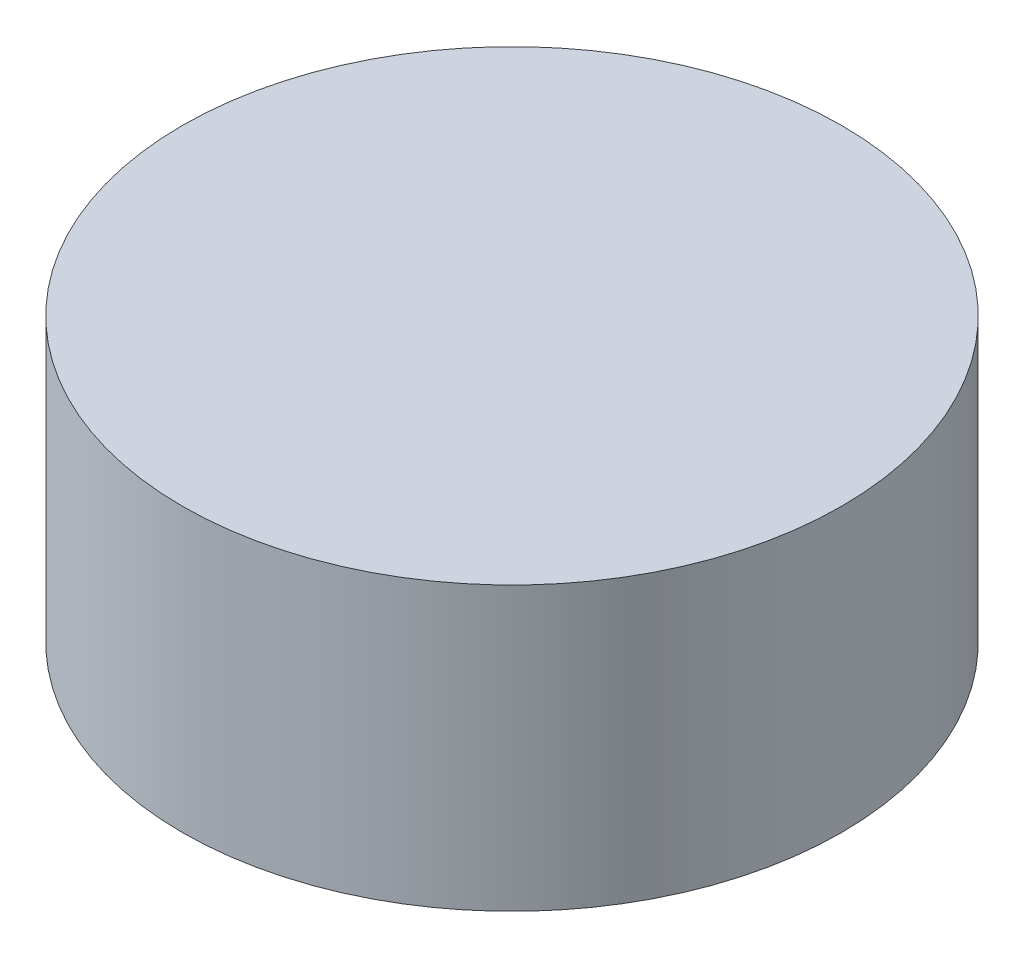
ISO-10303-21;
HEADER;
FILE_DESCRIPTION(('STEP AP214'),'2;1');
FILE_NAME('part.step','',(''),(''),'','','');
FILE_SCHEMA(('AUTOMOTIVE_DESIGN { 1 0 10303 214 1 1 1 1 }'));
ENDSEC;
DATA;
#1=APPLICATION_CONTEXT('core data for automotive mechanical design processes');
#2=APPLICATION_PROTOCOL_DEFINITION('international standard','automotive_design',2000,#1);
#3=PRODUCT_CONTEXT('',#1,'mechanical');
#4=PRODUCT('Part','Part','',(#3));
#5=PRODUCT_RELATED_PRODUCT_CATEGORY('part','',(#4));
#6=PRODUCT_DEFINITION_FORMATION('','',#4);
#7=PRODUCT_DEFINITION_CONTEXT('part definition',#1,'design');
#8=PRODUCT_DEFINITION('design','',#6,#7);
#9=PRODUCT_DEFINITION_SHAPE('','',#8);
#10=(LENGTH_UNIT() NAMED_UNIT(*) SI_UNIT(.MILLI.,.METRE.));
#11=(NAMED_UNIT(*) PLANE_ANGLE_UNIT() SI_UNIT($,.RADIAN.));
#12=(NAMED_UNIT(*) SI_UNIT($,.STERADIAN.) SOLID_ANGLE_UNIT());
#13=UNCERTAINTY_MEASURE_WITH_UNIT(LENGTH_MEASURE(1.E-05),#10,'distance_accuracy_value','');
#14=(GEOMETRIC_REPRESENTATION_CONTEXT(3) GLOBAL_UNCERTAINTY_ASSIGNED_CONTEXT((#13)) GLOBAL_UNIT_ASSIGNED_CONTEXT((#10,
#11,#12)) REPRESENTATION_CONTEXT('',''));
#15=CARTESIAN_POINT('',(0.,0.,0.));
#16=DIRECTION('',(0.,0.,1.));
#17=DIRECTION('',(1.,0.,0.));
#18=AXIS2_PLACEMENT_3D('',#15,#16,#17);
#19=CARTESIAN_POINT('',(0.,-30.,0.));
#20=DIRECTION('',(0.,1.,0.));
#21=DIRECTION('',(0.,0.,1.));
#22=AXIS2_PLACEMENT_3D('',#19,#20,#21);
#23=CYLINDRICAL_SURFACE('',#22,35.);
#24=CARTESIAN_POINT('',(0.,-30.,0.));
#25=DIRECTION('',(0.,1.,0.));
#26=DIRECTION('',(0.,0.,1.));
#27=AXIS2_PLACEMENT_3D('',#24,#25,#26);
#28=CIRCLE('',#27,35.);
#29=CARTESIAN_POINT('',(0.,-30.,35.));
#30=VERTEX_POINT('',#29);
#31=EDGE_CURVE('E10',#30,#30,#28,.T.);
#32=ORIENTED_EDGE('',*,*,#31,.T.);
#33=EDGE_LOOP('',(#32));
#34=FACE_BOUND('',#33,.T.);
#35=CARTESIAN_POINT('',(0.,0.,0.));
#36=DIRECTION('',(0.,1.,0.));
#37=DIRECTION('',(0.,0.,1.));
#38=AXIS2_PLACEMENT_3D('',#35,#36,#37);
#39=CIRCLE('',#38,35.);
#40=CARTESIAN_POINT('',(0.,0.,35.));
#41=VERTEX_POINT('',#40);
#42=EDGE_CURVE('E44',#41,#41,#39,.T.);
#43=ORIENTED_EDGE('',*,*,#42,.F.);
#44=EDGE_LOOP('',(#43));
#45=FACE_BOUND('',#44,.T.);
#46=ADVANCED_FACE('F41',(#34,#45),#23,.T.);
#47=CARTESIAN_POINT('',(0.,-30.,0.));
#48=DIRECTION('',(0.,1.,0.));
#49=DIRECTION('',(0.,0.,1.));
#50=AXIS2_PLACEMENT_3D('',#47,#48,#49);
#51=PLANE('',#50);
#52=ORIENTED_EDGE('',*,*,#31,.F.);
#53=EDGE_LOOP('',(#52));
#54=FACE_BOUND('',#53,.T.);
#55=ADVANCED_FACE('F58',(#54),#51,.F.);
#56=CARTESIAN_POINT('',(0.,0.,0.));
#57=DIRECTION('',(0.,1.,0.));
#58=DIRECTION('',(0.,0.,1.));
#59=AXIS2_PLACEMENT_3D('',#56,#57,#58);
#60=PLANE('',#59);
#61=ORIENTED_EDGE('',*,*,#42,.T.);
#62=EDGE_LOOP('',(#61));
#63=FACE_BOUND('',#62,.T.);
#64=ADVANCED_FACE('F55',(#63),#60,.T.);
#65=CLOSED_SHELL('',(#46,#55,#64));
#66=MANIFOLD_SOLID_BREP('B2',#65);
#67=ADVANCED_BREP_SHAPE_REPRESENTATION('',(#18,#66),#14);
#68=SHAPE_DEFINITION_REPRESENTATION(#9,#67);
ENDSEC;
END-ISO-10303-21;
